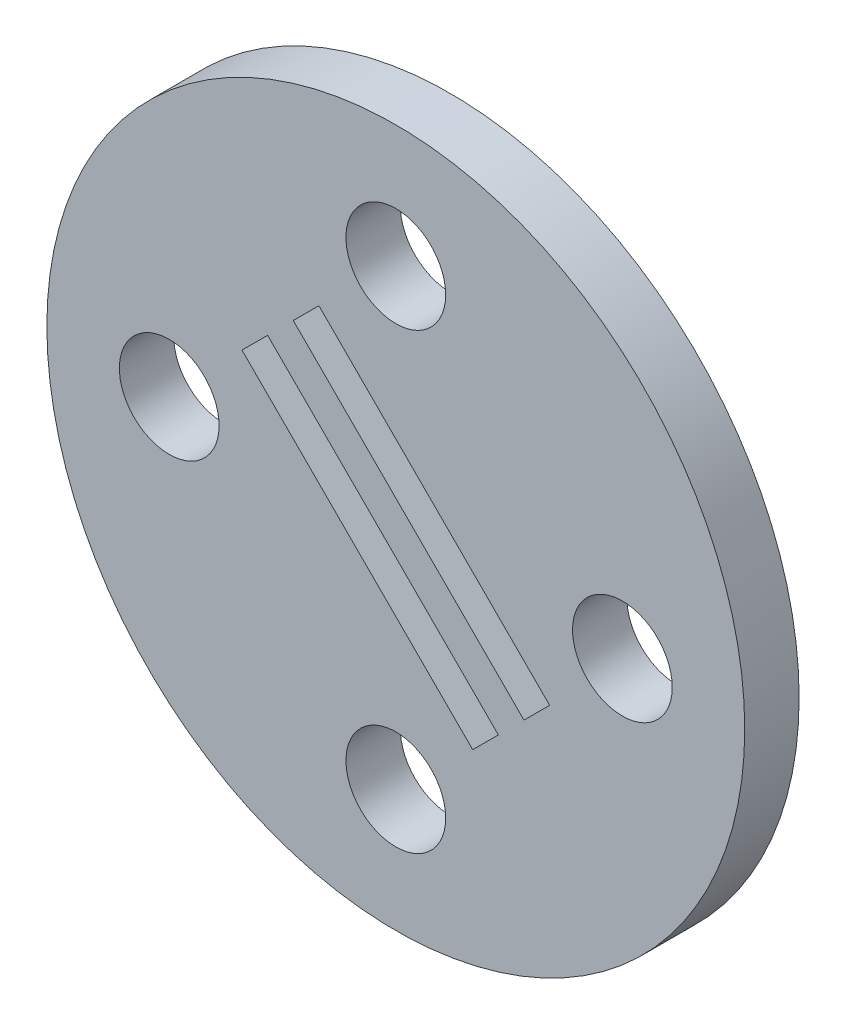
ISO-10303-21;
HEADER;
FILE_DESCRIPTION(('STEP AP214'),'2;1');
FILE_NAME('part.step','',(''),(''),'','','');
FILE_SCHEMA(('AUTOMOTIVE_DESIGN { 1 0 10303 214 1 1 1 1 }'));
ENDSEC;
DATA;
#1=APPLICATION_CONTEXT('core data for automotive mechanical design processes');
#2=APPLICATION_PROTOCOL_DEFINITION('international standard','automotive_design',2000,#1);
#3=PRODUCT_CONTEXT('',#1,'mechanical');
#4=PRODUCT('Part','Part','',(#3));
#5=PRODUCT_RELATED_PRODUCT_CATEGORY('part','',(#4));
#6=PRODUCT_DEFINITION_FORMATION('','',#4);
#7=PRODUCT_DEFINITION_CONTEXT('part definition',#1,'design');
#8=PRODUCT_DEFINITION('design','',#6,#7);
#9=PRODUCT_DEFINITION_SHAPE('','',#8);
#10=(LENGTH_UNIT() NAMED_UNIT(*) SI_UNIT(.MILLI.,.METRE.));
#11=(NAMED_UNIT(*) PLANE_ANGLE_UNIT() SI_UNIT($,.RADIAN.));
#12=(NAMED_UNIT(*) SI_UNIT($,.STERADIAN.) SOLID_ANGLE_UNIT());
#13=UNCERTAINTY_MEASURE_WITH_UNIT(LENGTH_MEASURE(1.E-05),#10,'distance_accuracy_value','');
#14=(GEOMETRIC_REPRESENTATION_CONTEXT(3) GLOBAL_UNCERTAINTY_ASSIGNED_CONTEXT((#13)) GLOBAL_UNIT_ASSIGNED_CONTEXT((#10,
#11,#12)) REPRESENTATION_CONTEXT('',''));
#15=CARTESIAN_POINT('',(0.,0.,0.));
#16=DIRECTION('',(0.,0.,1.));
#17=DIRECTION('',(1.,0.,0.));
#18=AXIS2_PLACEMENT_3D('',#15,#16,#17);
#19=CARTESIAN_POINT('',(0.,0.,6.));
#20=DIRECTION('',(0.,0.,1.));
#21=DIRECTION('',(1.,0.,0.));
#22=AXIS2_PLACEMENT_3D('',#19,#20,#21);
#23=PLANE('',#22);
#24=CARTESIAN_POINT('',(0.,-25.0000000000001,6.));
#25=DIRECTION('',(0.,0.,1.));
#26=DIRECTION('',(1.,0.,0.));
#27=AXIS2_PLACEMENT_3D('',#24,#25,#26);
#28=CIRCLE('',#27,5.50000000000006);
#29=CARTESIAN_POINT('',(5.50000000000006,-25.0000000000001,6.));
#30=VERTEX_POINT('',#29);
#31=EDGE_CURVE('E190',#30,#30,#28,.T.);
#32=ORIENTED_EDGE('',*,*,#31,.F.);
#33=EDGE_LOOP('',(#32));
#34=FACE_BOUND('',#33,.T.);
#35=CARTESIAN_POINT('',(-24.9999999999999,0.,6.));
#36=DIRECTION('',(0.,0.,1.));
#37=DIRECTION('',(1.,0.,0.));
#38=AXIS2_PLACEMENT_3D('',#35,#36,#37);
#39=CIRCLE('',#38,5.50000000000006);
#40=CARTESIAN_POINT('',(-19.4999999999999,0.,6.));
#41=VERTEX_POINT('',#40);
#42=EDGE_CURVE('E126',#41,#41,#39,.T.);
#43=ORIENTED_EDGE('',*,*,#42,.F.);
#44=EDGE_LOOP('',(#43));
#45=FACE_BOUND('',#44,.T.);
#46=DIRECTION('',(0.707106781186546,0.707106781186549,0.));
#47=VECTOR('',#46,1.);
#48=CARTESIAN_POINT('',(11.3137084989848,-14.1421356237309,6.));
#49=LINE('',#48,#47);
#50=CARTESIAN_POINT('',(8.4852813742386,-16.9705627484771,6.));
#51=VERTEX_POINT('',#50);
#52=CARTESIAN_POINT('',(11.3137084989848,-14.1421356237309,6.));
#53=VERTEX_POINT('',#52);
#54=EDGE_CURVE('E138',#51,#53,#49,.T.);
#55=ORIENTED_EDGE('',*,*,#54,.F.);
#56=DIRECTION('',(0.707106781186549,-0.707106781186546,0.));
#57=VECTOR('',#56,1.);
#58=CARTESIAN_POINT('',(8.4852813742386,-16.9705627484771,6.));
#59=LINE('',#58,#57);
#60=CARTESIAN_POINT('',(-16.9705627484772,8.48528137423854,6.));
#61=VERTEX_POINT('',#60);
#62=EDGE_CURVE('E136',#61,#51,#59,.T.);
#63=ORIENTED_EDGE('',*,*,#62,.F.);
#64=DIRECTION('',(-0.707106781186546,-0.707106781186549,0.));
#65=VECTOR('',#64,1.);
#66=CARTESIAN_POINT('',(-16.9705627484772,8.48528137423854,6.));
#67=LINE('',#66,#65);
#68=CARTESIAN_POINT('',(-14.142135623731,11.3137084989847,6.));
#69=VERTEX_POINT('',#68);
#70=EDGE_CURVE('E144',#69,#61,#67,.T.);
#71=ORIENTED_EDGE('',*,*,#70,.F.);
#72=DIRECTION('',(-0.707106781186549,0.707106781186546,0.));
#73=VECTOR('',#72,1.);
#74=CARTESIAN_POINT('',(-14.142135623731,11.3137084989847,6.));
#75=LINE('',#74,#73);
#76=EDGE_CURVE('E141',#53,#69,#75,.T.);
#77=ORIENTED_EDGE('',*,*,#76,.F.);
#78=EDGE_LOOP('',(#55,#63,#71,#77));
#79=FACE_BOUND('',#78,.T.);
#80=CARTESIAN_POINT('',(0.,0.,6.));
#81=DIRECTION('',(0.,0.,1.));
#82=DIRECTION('',(1.,0.,0.));
#83=AXIS2_PLACEMENT_3D('',#80,#81,#82);
#84=CIRCLE('',#83,38.5);
#85=CARTESIAN_POINT('',(38.5,0.,6.));
#86=VERTEX_POINT('',#85);
#87=EDGE_CURVE('E11',#86,#86,#84,.T.);
#88=ORIENTED_EDGE('',*,*,#87,.T.);
#89=EDGE_LOOP('',(#88));
#90=FACE_BOUND('',#89,.T.);
#91=DIRECTION('',(0.707106781186549,-0.707106781186546,0.));
#92=VECTOR('',#91,1.);
#93=CARTESIAN_POINT('',(-11.3137084989848,14.1421356237309,6.));
#94=LINE('',#93,#92);
#95=CARTESIAN_POINT('',(-11.3137084989848,14.1421356237309,6.));
#96=VERTEX_POINT('',#95);
#97=CARTESIAN_POINT('',(14.142135623731,-11.3137084989847,6.));
#98=VERTEX_POINT('',#97);
#99=EDGE_CURVE('E105',#96,#98,#94,.T.);
#100=ORIENTED_EDGE('',*,*,#99,.F.);
#101=DIRECTION('',(-0.707106781186546,-0.707106781186549,0.));
#102=VECTOR('',#101,1.);
#103=CARTESIAN_POINT('',(-8.4852813742386,16.9705627484771,6.));
#104=LINE('',#103,#102);
#105=CARTESIAN_POINT('',(-8.4852813742386,16.9705627484771,6.));
#106=VERTEX_POINT('',#105);
#107=EDGE_CURVE('E97',#106,#96,#104,.T.);
#108=ORIENTED_EDGE('',*,*,#107,.F.);
#109=DIRECTION('',(-0.707106781186549,0.707106781186546,0.));
#110=VECTOR('',#109,1.);
#111=CARTESIAN_POINT('',(16.9705627484772,-8.48528137423854,6.));
#112=LINE('',#111,#110);
#113=CARTESIAN_POINT('',(16.9705627484772,-8.48528137423854,6.));
#114=VERTEX_POINT('',#113);
#115=EDGE_CURVE('E120',#114,#106,#112,.T.);
#116=ORIENTED_EDGE('',*,*,#115,.F.);
#117=DIRECTION('',(0.707106781186546,0.707106781186549,0.));
#118=VECTOR('',#117,1.);
#119=CARTESIAN_POINT('',(14.142135623731,-11.3137084989847,6.));
#120=LINE('',#119,#118);
#121=EDGE_CURVE('E118',#98,#114,#120,.T.);
#122=ORIENTED_EDGE('',*,*,#121,.F.);
#123=EDGE_LOOP('',(#100,#108,#116,#122));
#124=FACE_BOUND('',#123,.T.);
#125=CARTESIAN_POINT('',(0.,24.9999999999999,6.));
#126=DIRECTION('',(0.,0.,1.));
#127=DIRECTION('',(1.,0.,0.));
#128=AXIS2_PLACEMENT_3D('',#125,#126,#127);
#129=CIRCLE('',#128,5.50000000000006);
#130=CARTESIAN_POINT('',(5.50000000000006,24.9999999999999,6.));
#131=VERTEX_POINT('',#130);
#132=EDGE_CURVE('E195',#131,#131,#129,.T.);
#133=ORIENTED_EDGE('',*,*,#132,.F.);
#134=EDGE_LOOP('',(#133));
#135=FACE_BOUND('',#134,.T.);
#136=CARTESIAN_POINT('',(25.0000000000004,0.,6.));
#137=DIRECTION('',(0.,0.,1.));
#138=DIRECTION('',(1.,0.,0.));
#139=AXIS2_PLACEMENT_3D('',#136,#137,#138);
#140=CIRCLE('',#139,5.50000000000006);
#141=CARTESIAN_POINT('',(30.5000000000004,0.,6.));
#142=VERTEX_POINT('',#141);
#143=EDGE_CURVE('E184',#142,#142,#140,.T.);
#144=ORIENTED_EDGE('',*,*,#143,.F.);
#145=EDGE_LOOP('',(#144));
#146=FACE_BOUND('',#145,.T.);
#147=ADVANCED_FACE('F32',(#34,#45,#79,#90,#124,#135,#146),#23,.T.);
#148=CARTESIAN_POINT('',(0.,0.,0.));
#149=DIRECTION('',(0.,0.,1.));
#150=DIRECTION('',(1.,0.,0.));
#151=AXIS2_PLACEMENT_3D('',#148,#149,#150);
#152=PLANE('',#151);
#153=CARTESIAN_POINT('',(0.,-25.0000000000001,0.));
#154=DIRECTION('',(0.,0.,1.));
#155=DIRECTION('',(1.,0.,0.));
#156=AXIS2_PLACEMENT_3D('',#153,#154,#155);
#157=CIRCLE('',#156,5.50000000000006);
#158=CARTESIAN_POINT('',(5.50000000000006,-25.0000000000001,0.));
#159=VERTEX_POINT('',#158);
#160=EDGE_CURVE('E187',#159,#159,#157,.T.);
#161=ORIENTED_EDGE('',*,*,#160,.T.);
#162=EDGE_LOOP('',(#161));
#163=FACE_BOUND('',#162,.T.);
#164=CARTESIAN_POINT('',(-24.9999999999999,0.,0.));
#165=DIRECTION('',(0.,0.,1.));
#166=DIRECTION('',(1.,0.,0.));
#167=AXIS2_PLACEMENT_3D('',#164,#165,#166);
#168=CIRCLE('',#167,5.50000000000006);
#169=CARTESIAN_POINT('',(-19.4999999999999,0.,0.));
#170=VERTEX_POINT('',#169);
#171=EDGE_CURVE('E198',#170,#170,#168,.T.);
#172=ORIENTED_EDGE('',*,*,#171,.T.);
#173=EDGE_LOOP('',(#172));
#174=FACE_BOUND('',#173,.T.);
#175=DIRECTION('',(0.707106781186549,-0.707106781186546,0.));
#176=VECTOR('',#175,1.);
#177=CARTESIAN_POINT('',(8.4852813742386,-16.9705627484771,0.));
#178=LINE('',#177,#176);
#179=CARTESIAN_POINT('',(-16.9705627484772,8.48528137423854,0.));
#180=VERTEX_POINT('',#179);
#181=CARTESIAN_POINT('',(8.4852813742386,-16.9705627484771,0.));
#182=VERTEX_POINT('',#181);
#183=EDGE_CURVE('E113',#180,#182,#178,.T.);
#184=ORIENTED_EDGE('',*,*,#183,.T.);
#185=DIRECTION('',(0.707106781186546,0.707106781186549,0.));
#186=VECTOR('',#185,1.);
#187=CARTESIAN_POINT('',(11.3137084989848,-14.1421356237309,0.));
#188=LINE('',#187,#186);
#189=CARTESIAN_POINT('',(11.3137084989848,-14.1421356237309,0.));
#190=VERTEX_POINT('',#189);
#191=EDGE_CURVE('E149',#182,#190,#188,.T.);
#192=ORIENTED_EDGE('',*,*,#191,.T.);
#193=DIRECTION('',(-0.707106781186549,0.707106781186546,0.));
#194=VECTOR('',#193,1.);
#195=CARTESIAN_POINT('',(-14.142135623731,11.3137084989847,0.));
#196=LINE('',#195,#194);
#197=CARTESIAN_POINT('',(-14.142135623731,11.3137084989847,0.));
#198=VERTEX_POINT('',#197);
#199=EDGE_CURVE('E152',#190,#198,#196,.T.);
#200=ORIENTED_EDGE('',*,*,#199,.T.);
#201=DIRECTION('',(-0.707106781186546,-0.707106781186549,0.));
#202=VECTOR('',#201,1.);
#203=CARTESIAN_POINT('',(-16.9705627484772,8.48528137423854,0.));
#204=LINE('',#203,#202);
#205=EDGE_CURVE('E139',#198,#180,#204,.T.);
#206=ORIENTED_EDGE('',*,*,#205,.T.);
#207=EDGE_LOOP('',(#184,#192,#200,#206));
#208=FACE_BOUND('',#207,.T.);
#209=CARTESIAN_POINT('',(0.,0.,0.));
#210=DIRECTION('',(0.,0.,1.));
#211=DIRECTION('',(1.,0.,0.));
#212=AXIS2_PLACEMENT_3D('',#209,#210,#211);
#213=CIRCLE('',#212,38.5);
#214=CARTESIAN_POINT('',(38.5,0.,0.));
#215=VERTEX_POINT('',#214);
#216=EDGE_CURVE('E36',#215,#215,#213,.T.);
#217=ORIENTED_EDGE('',*,*,#216,.F.);
#218=EDGE_LOOP('',(#217));
#219=FACE_BOUND('',#218,.T.);
#220=DIRECTION('',(-0.707106781186546,-0.707106781186549,0.));
#221=VECTOR('',#220,1.);
#222=CARTESIAN_POINT('',(-8.4852813742386,16.9705627484771,0.));
#223=LINE('',#222,#221);
#224=CARTESIAN_POINT('',(-8.4852813742386,16.9705627484771,0.));
#225=VERTEX_POINT('',#224);
#226=CARTESIAN_POINT('',(-11.3137084989848,14.1421356237309,0.));
#227=VERTEX_POINT('',#226);
#228=EDGE_CURVE('E55',#225,#227,#223,.T.);
#229=ORIENTED_EDGE('',*,*,#228,.T.);
#230=DIRECTION('',(0.707106781186549,-0.707106781186546,0.));
#231=VECTOR('',#230,1.);
#232=CARTESIAN_POINT('',(-11.3137084989848,14.1421356237309,0.));
#233=LINE('',#232,#231);
#234=CARTESIAN_POINT('',(14.142135623731,-11.3137084989847,0.));
#235=VERTEX_POINT('',#234);
#236=EDGE_CURVE('E112',#227,#235,#233,.T.);
#237=ORIENTED_EDGE('',*,*,#236,.T.);
#238=DIRECTION('',(0.707106781186546,0.707106781186549,0.));
#239=VECTOR('',#238,1.);
#240=CARTESIAN_POINT('',(14.142135623731,-11.3137084989847,0.));
#241=LINE('',#240,#239);
#242=CARTESIAN_POINT('',(16.9705627484772,-8.48528137423854,0.));
#243=VERTEX_POINT('',#242);
#244=EDGE_CURVE('E128',#235,#243,#241,.T.);
#245=ORIENTED_EDGE('',*,*,#244,.T.);
#246=DIRECTION('',(-0.707106781186549,0.707106781186546,0.));
#247=VECTOR('',#246,1.);
#248=CARTESIAN_POINT('',(16.9705627484772,-8.48528137423854,0.));
#249=LINE('',#248,#247);
#250=EDGE_CURVE('E106',#243,#225,#249,.T.);
#251=ORIENTED_EDGE('',*,*,#250,.T.);
#252=EDGE_LOOP('',(#229,#237,#245,#251));
#253=FACE_BOUND('',#252,.T.);
#254=CARTESIAN_POINT('',(0.,24.9999999999999,0.));
#255=DIRECTION('',(0.,0.,1.));
#256=DIRECTION('',(1.,0.,0.));
#257=AXIS2_PLACEMENT_3D('',#254,#255,#256);
#258=CIRCLE('',#257,5.50000000000006);
#259=CARTESIAN_POINT('',(5.50000000000006,24.9999999999999,0.));
#260=VERTEX_POINT('',#259);
#261=EDGE_CURVE('E179',#260,#260,#258,.T.);
#262=ORIENTED_EDGE('',*,*,#261,.T.);
#263=EDGE_LOOP('',(#262));
#264=FACE_BOUND('',#263,.T.);
#265=CARTESIAN_POINT('',(25.0000000000004,0.,0.));
#266=DIRECTION('',(0.,0.,1.));
#267=DIRECTION('',(1.,0.,0.));
#268=AXIS2_PLACEMENT_3D('',#265,#266,#267);
#269=CIRCLE('',#268,5.50000000000006);
#270=CARTESIAN_POINT('',(30.5000000000004,0.,0.));
#271=VERTEX_POINT('',#270);
#272=EDGE_CURVE('E182',#271,#271,#269,.T.);
#273=ORIENTED_EDGE('',*,*,#272,.T.);
#274=EDGE_LOOP('',(#273));
#275=FACE_BOUND('',#274,.T.);
#276=ADVANCED_FACE('F171',(#163,#174,#208,#219,#253,#264,#275),#152,.F.);
#277=CARTESIAN_POINT('',(0.,0.,6.));
#278=DIRECTION('',(0.,0.,-1.));
#279=DIRECTION('',(-1.,0.,0.));
#280=AXIS2_PLACEMENT_3D('',#277,#278,#279);
#281=CYLINDRICAL_SURFACE('',#280,38.5);
#282=ORIENTED_EDGE('',*,*,#87,.F.);
#283=EDGE_LOOP('',(#282));
#284=FACE_BOUND('',#283,.T.);
#285=ORIENTED_EDGE('',*,*,#216,.T.);
#286=EDGE_LOOP('',(#285));
#287=FACE_BOUND('',#286,.T.);
#288=ADVANCED_FACE('F34',(#284,#287),#281,.T.);
#289=CARTESIAN_POINT('',(8.4852813742386,-16.9705627484771,6.));
#290=DIRECTION('',(0.707106781186546,0.707106781186549,0.));
#291=DIRECTION('',(-0.707106781186549,0.707106781186546,0.));
#292=AXIS2_PLACEMENT_3D('',#289,#290,#291);
#293=PLANE('',#292);
#294=ORIENTED_EDGE('',*,*,#183,.F.);
#295=DIRECTION('',(0.,0.,-1.));
#296=VECTOR('',#295,1.);
#297=CARTESIAN_POINT('',(-16.9705627484772,8.48528137423854,6.));
#298=LINE('',#297,#296);
#299=EDGE_CURVE('E146',#61,#180,#298,.T.);
#300=ORIENTED_EDGE('',*,*,#299,.F.);
#301=ORIENTED_EDGE('',*,*,#62,.T.);
#302=DIRECTION('',(0.,0.,-1.));
#303=VECTOR('',#302,1.);
#304=CARTESIAN_POINT('',(8.4852813742386,-16.9705627484771,6.));
#305=LINE('',#304,#303);
#306=EDGE_CURVE('E163',#51,#182,#305,.T.);
#307=ORIENTED_EDGE('',*,*,#306,.T.);
#308=EDGE_LOOP('',(#294,#300,#301,#307));
#309=FACE_BOUND('',#308,.T.);
#310=ADVANCED_FACE('F229',(#309),#293,.T.);
#311=CARTESIAN_POINT('',(11.3137084989848,-14.1421356237309,6.));
#312=DIRECTION('',(-0.707106781186549,0.707106781186546,0.));
#313=DIRECTION('',(-0.707106781186546,-0.707106781186549,0.));
#314=AXIS2_PLACEMENT_3D('',#311,#312,#313);
#315=PLANE('',#314);
#316=ORIENTED_EDGE('',*,*,#191,.F.);
#317=ORIENTED_EDGE('',*,*,#306,.F.);
#318=ORIENTED_EDGE('',*,*,#54,.T.);
#319=DIRECTION('',(0.,0.,-1.));
#320=VECTOR('',#319,1.);
#321=CARTESIAN_POINT('',(11.3137084989848,-14.1421356237309,6.));
#322=LINE('',#321,#320);
#323=EDGE_CURVE('E161',#53,#190,#322,.T.);
#324=ORIENTED_EDGE('',*,*,#323,.T.);
#325=EDGE_LOOP('',(#316,#317,#318,#324));
#326=FACE_BOUND('',#325,.T.);
#327=ADVANCED_FACE('F232',(#326),#315,.T.);
#328=CARTESIAN_POINT('',(-14.142135623731,11.3137084989847,6.));
#329=DIRECTION('',(-0.707106781186546,-0.707106781186549,0.));
#330=DIRECTION('',(0.707106781186549,-0.707106781186546,0.));
#331=AXIS2_PLACEMENT_3D('',#328,#329,#330);
#332=PLANE('',#331);
#333=ORIENTED_EDGE('',*,*,#199,.F.);
#334=ORIENTED_EDGE('',*,*,#323,.F.);
#335=ORIENTED_EDGE('',*,*,#76,.T.);
#336=DIRECTION('',(0.,0.,-1.));
#337=VECTOR('',#336,1.);
#338=CARTESIAN_POINT('',(-14.142135623731,11.3137084989847,6.));
#339=LINE('',#338,#337);
#340=EDGE_CURVE('E159',#69,#198,#339,.T.);
#341=ORIENTED_EDGE('',*,*,#340,.T.);
#342=EDGE_LOOP('',(#333,#334,#335,#341));
#343=FACE_BOUND('',#342,.T.);
#344=ADVANCED_FACE('F235',(#343),#332,.T.);
#345=CARTESIAN_POINT('',(-16.9705627484772,8.48528137423854,6.));
#346=DIRECTION('',(0.707106781186549,-0.707106781186546,0.));
#347=DIRECTION('',(0.707106781186546,0.707106781186549,0.));
#348=AXIS2_PLACEMENT_3D('',#345,#346,#347);
#349=PLANE('',#348);
#350=ORIENTED_EDGE('',*,*,#205,.F.);
#351=ORIENTED_EDGE('',*,*,#340,.F.);
#352=ORIENTED_EDGE('',*,*,#70,.T.);
#353=ORIENTED_EDGE('',*,*,#299,.T.);
#354=EDGE_LOOP('',(#350,#351,#352,#353));
#355=FACE_BOUND('',#354,.T.);
#356=ADVANCED_FACE('F239',(#355),#349,.T.);
#357=CARTESIAN_POINT('',(-8.4852813742386,16.9705627484771,6.));
#358=DIRECTION('',(0.707106781186549,-0.707106781186546,0.));
#359=DIRECTION('',(0.707106781186546,0.707106781186549,0.));
#360=AXIS2_PLACEMENT_3D('',#357,#358,#359);
#361=PLANE('',#360);
#362=ORIENTED_EDGE('',*,*,#228,.F.);
#363=DIRECTION('',(0.,0.,-1.));
#364=VECTOR('',#363,1.);
#365=CARTESIAN_POINT('',(-8.4852813742386,16.9705627484771,6.));
#366=LINE('',#365,#364);
#367=EDGE_CURVE('E101',#106,#225,#366,.T.);
#368=ORIENTED_EDGE('',*,*,#367,.F.);
#369=ORIENTED_EDGE('',*,*,#107,.T.);
#370=DIRECTION('',(0.,0.,-1.));
#371=VECTOR('',#370,1.);
#372=CARTESIAN_POINT('',(-11.3137084989848,14.1421356237309,6.));
#373=LINE('',#372,#371);
#374=EDGE_CURVE('E100',#96,#227,#373,.T.);
#375=ORIENTED_EDGE('',*,*,#374,.T.);
#376=EDGE_LOOP('',(#362,#368,#369,#375));
#377=FACE_BOUND('',#376,.T.);
#378=ADVANCED_FACE('F99',(#377),#361,.T.);
#379=CARTESIAN_POINT('',(-11.3137084989848,14.1421356237309,6.));
#380=DIRECTION('',(0.707106781186546,0.707106781186549,0.));
#381=DIRECTION('',(-0.707106781186549,0.707106781186546,0.));
#382=AXIS2_PLACEMENT_3D('',#379,#380,#381);
#383=PLANE('',#382);
#384=ORIENTED_EDGE('',*,*,#236,.F.);
#385=ORIENTED_EDGE('',*,*,#374,.F.);
#386=ORIENTED_EDGE('',*,*,#99,.T.);
#387=DIRECTION('',(0.,0.,-1.));
#388=VECTOR('',#387,1.);
#389=CARTESIAN_POINT('',(14.142135623731,-11.3137084989847,6.));
#390=LINE('',#389,#388);
#391=EDGE_CURVE('E114',#98,#235,#390,.T.);
#392=ORIENTED_EDGE('',*,*,#391,.T.);
#393=EDGE_LOOP('',(#384,#385,#386,#392));
#394=FACE_BOUND('',#393,.T.);
#395=ADVANCED_FACE('F109',(#394),#383,.T.);
#396=CARTESIAN_POINT('',(14.142135623731,-11.3137084989847,6.));
#397=DIRECTION('',(-0.707106781186549,0.707106781186546,0.));
#398=DIRECTION('',(-0.707106781186546,-0.707106781186549,0.));
#399=AXIS2_PLACEMENT_3D('',#396,#397,#398);
#400=PLANE('',#399);
#401=ORIENTED_EDGE('',*,*,#244,.F.);
#402=ORIENTED_EDGE('',*,*,#391,.F.);
#403=ORIENTED_EDGE('',*,*,#121,.T.);
#404=DIRECTION('',(0.,0.,-1.));
#405=VECTOR('',#404,1.);
#406=CARTESIAN_POINT('',(16.9705627484772,-8.48528137423854,6.));
#407=LINE('',#406,#405);
#408=EDGE_CURVE('E47',#114,#243,#407,.T.);
#409=ORIENTED_EDGE('',*,*,#408,.T.);
#410=EDGE_LOOP('',(#401,#402,#403,#409));
#411=FACE_BOUND('',#410,.T.);
#412=ADVANCED_FACE('F219',(#411),#400,.T.);
#413=CARTESIAN_POINT('',(16.9705627484772,-8.48528137423854,6.));
#414=DIRECTION('',(-0.707106781186546,-0.707106781186549,0.));
#415=DIRECTION('',(0.707106781186549,-0.707106781186546,0.));
#416=AXIS2_PLACEMENT_3D('',#413,#414,#415);
#417=PLANE('',#416);
#418=ORIENTED_EDGE('',*,*,#250,.F.);
#419=ORIENTED_EDGE('',*,*,#408,.F.);
#420=ORIENTED_EDGE('',*,*,#115,.T.);
#421=ORIENTED_EDGE('',*,*,#367,.T.);
#422=EDGE_LOOP('',(#418,#419,#420,#421));
#423=FACE_BOUND('',#422,.T.);
#424=ADVANCED_FACE('F209',(#423),#417,.T.);
#425=CARTESIAN_POINT('',(-24.9999999999999,0.,6.));
#426=DIRECTION('',(0.,0.,-1.));
#427=DIRECTION('',(-1.,0.,0.));
#428=AXIS2_PLACEMENT_3D('',#425,#426,#427);
#429=CYLINDRICAL_SURFACE('',#428,5.50000000000006);
#430=ORIENTED_EDGE('',*,*,#42,.T.);
#431=EDGE_LOOP('',(#430));
#432=FACE_BOUND('',#431,.T.);
#433=ORIENTED_EDGE('',*,*,#171,.F.);
#434=EDGE_LOOP('',(#433));
#435=FACE_BOUND('',#434,.T.);
#436=ADVANCED_FACE('F206',(#432,#435),#429,.F.);
#437=CARTESIAN_POINT('',(0.,24.9999999999999,6.));
#438=DIRECTION('',(0.,0.,-1.));
#439=DIRECTION('',(-1.,0.,0.));
#440=AXIS2_PLACEMENT_3D('',#437,#438,#439);
#441=CYLINDRICAL_SURFACE('',#440,5.50000000000006);
#442=ORIENTED_EDGE('',*,*,#132,.T.);
#443=EDGE_LOOP('',(#442));
#444=FACE_BOUND('',#443,.T.);
#445=ORIENTED_EDGE('',*,*,#261,.F.);
#446=EDGE_LOOP('',(#445));
#447=FACE_BOUND('',#446,.T.);
#448=ADVANCED_FACE('F208',(#444,#447),#441,.F.);
#449=CARTESIAN_POINT('',(0.,-25.0000000000001,6.));
#450=DIRECTION('',(0.,0.,-1.));
#451=DIRECTION('',(-1.,0.,0.));
#452=AXIS2_PLACEMENT_3D('',#449,#450,#451);
#453=CYLINDRICAL_SURFACE('',#452,5.50000000000006);
#454=ORIENTED_EDGE('',*,*,#31,.T.);
#455=EDGE_LOOP('',(#454));
#456=FACE_BOUND('',#455,.T.);
#457=ORIENTED_EDGE('',*,*,#160,.F.);
#458=EDGE_LOOP('',(#457));
#459=FACE_BOUND('',#458,.T.);
#460=ADVANCED_FACE('F216',(#456,#459),#453,.F.);
#461=CARTESIAN_POINT('',(25.0000000000004,0.,6.));
#462=DIRECTION('',(0.,0.,-1.));
#463=DIRECTION('',(-1.,0.,0.));
#464=AXIS2_PLACEMENT_3D('',#461,#462,#463);
#465=CYLINDRICAL_SURFACE('',#464,5.50000000000006);
#466=ORIENTED_EDGE('',*,*,#143,.T.);
#467=EDGE_LOOP('',(#466));
#468=FACE_BOUND('',#467,.T.);
#469=ORIENTED_EDGE('',*,*,#272,.F.);
#470=EDGE_LOOP('',(#469));
#471=FACE_BOUND('',#470,.T.);
#472=ADVANCED_FACE('F278',(#468,#471),#465,.F.);
#473=CLOSED_SHELL('',(#147,#276,#288,#310,#327,#344,#356,#378,#395,#412,#424,#436,#448,#460,#472));
#474=MANIFOLD_SOLID_BREP('B2',#473);
#475=ADVANCED_BREP_SHAPE_REPRESENTATION('',(#18,#474),#14);
#476=SHAPE_DEFINITION_REPRESENTATION(#9,#475);
ENDSEC;
END-ISO-10303-21;
